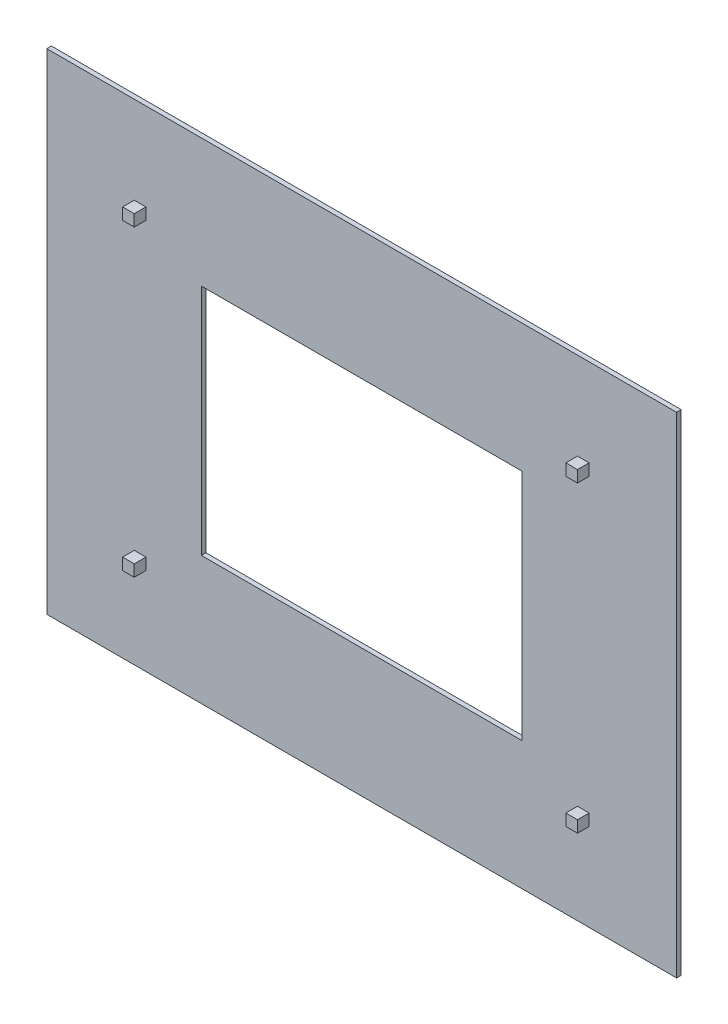
ISO-10303-21;
HEADER;
FILE_DESCRIPTION(('STEP AP214'),'2;1');
FILE_NAME('part.step','',(''),(''),'','','');
FILE_SCHEMA(('AUTOMOTIVE_DESIGN { 1 0 10303 214 1 1 1 1 }'));
ENDSEC;
DATA;
#1=APPLICATION_CONTEXT('core data for automotive mechanical design processes');
#2=APPLICATION_PROTOCOL_DEFINITION('international standard','automotive_design',2000,#1);
#3=PRODUCT_CONTEXT('',#1,'mechanical');
#4=PRODUCT('Part','Part','',(#3));
#5=PRODUCT_RELATED_PRODUCT_CATEGORY('part','',(#4));
#6=PRODUCT_DEFINITION_FORMATION('','',#4);
#7=PRODUCT_DEFINITION_CONTEXT('part definition',#1,'design');
#8=PRODUCT_DEFINITION('design','',#6,#7);
#9=PRODUCT_DEFINITION_SHAPE('','',#8);
#10=(LENGTH_UNIT() NAMED_UNIT(*) SI_UNIT(.MILLI.,.METRE.));
#11=(NAMED_UNIT(*) PLANE_ANGLE_UNIT() SI_UNIT($,.RADIAN.));
#12=(NAMED_UNIT(*) SI_UNIT($,.STERADIAN.) SOLID_ANGLE_UNIT());
#13=UNCERTAINTY_MEASURE_WITH_UNIT(LENGTH_MEASURE(1.E-05),#10,'distance_accuracy_value','');
#14=(GEOMETRIC_REPRESENTATION_CONTEXT(3) GLOBAL_UNCERTAINTY_ASSIGNED_CONTEXT((#13)) GLOBAL_UNIT_ASSIGNED_CONTEXT((#10,
#11,#12)) REPRESENTATION_CONTEXT('',''));
#15=CARTESIAN_POINT('',(0.,0.,0.));
#16=DIRECTION('',(0.,0.,1.));
#17=DIRECTION('',(1.,0.,0.));
#18=AXIS2_PLACEMENT_3D('',#15,#16,#17);
#19=CARTESIAN_POINT('',(0.,0.,1.));
#20=DIRECTION('',(0.,0.,1.));
#21=DIRECTION('',(1.,0.,0.));
#22=AXIS2_PLACEMENT_3D('',#19,#20,#21);
#23=PLANE('',#22);
#24=DIRECTION('',(0.,1.,0.));
#25=VECTOR('',#24,1.);
#26=CARTESIAN_POINT('',(34.925,-25.4,1.));
#27=LINE('',#26,#25);
#28=CARTESIAN_POINT('',(34.925,-25.4,1.));
#29=VERTEX_POINT('',#28);
#30=CARTESIAN_POINT('',(34.925,25.4,1.));
#31=VERTEX_POINT('',#30);
#32=EDGE_CURVE('E61',#29,#31,#27,.T.);
#33=ORIENTED_EDGE('',*,*,#32,.F.);
#34=DIRECTION('',(1.,0.,0.));
#35=VECTOR('',#34,1.);
#36=CARTESIAN_POINT('',(-34.925,-25.4,1.));
#37=LINE('',#36,#35);
#38=CARTESIAN_POINT('',(-34.925,-25.4,1.));
#39=VERTEX_POINT('',#38);
#40=EDGE_CURVE('E227',#39,#29,#37,.T.);
#41=ORIENTED_EDGE('',*,*,#40,.F.);
#42=DIRECTION('',(0.,-1.,0.));
#43=VECTOR('',#42,1.);
#44=CARTESIAN_POINT('',(-34.925,-25.4,1.));
#45=LINE('',#44,#43);
#46=CARTESIAN_POINT('',(-34.925,25.4,1.));
#47=VERTEX_POINT('',#46);
#48=EDGE_CURVE('E210',#47,#39,#45,.T.);
#49=ORIENTED_EDGE('',*,*,#48,.F.);
#50=DIRECTION('',(-1.,0.,0.));
#51=VECTOR('',#50,1.);
#52=CARTESIAN_POINT('',(-34.925,25.4,1.));
#53=LINE('',#52,#51);
#54=EDGE_CURVE('E220',#31,#47,#53,.T.);
#55=ORIENTED_EDGE('',*,*,#54,.F.);
#56=EDGE_LOOP('',(#33,#41,#49,#55));
#57=FACE_BOUND('',#56,.T.);
#58=DIRECTION('',(0.,1.,0.));
#59=VECTOR('',#58,1.);
#60=CARTESIAN_POINT('',(68.58,53.34,1.));
#61=LINE('',#60,#59);
#62=CARTESIAN_POINT('',(68.58,-53.34,1.));
#63=VERTEX_POINT('',#62);
#64=CARTESIAN_POINT('',(68.58,53.34,1.));
#65=VERTEX_POINT('',#64);
#66=EDGE_CURVE('E406',#63,#65,#61,.T.);
#67=ORIENTED_EDGE('',*,*,#66,.T.);
#68=DIRECTION('',(-1.,0.,0.));
#69=VECTOR('',#68,1.);
#70=CARTESIAN_POINT('',(-68.58,53.34,1.));
#71=LINE('',#70,#69);
#72=CARTESIAN_POINT('',(-68.58,53.34,1.));
#73=VERTEX_POINT('',#72);
#74=EDGE_CURVE('E410',#65,#73,#71,.T.);
#75=ORIENTED_EDGE('',*,*,#74,.T.);
#76=DIRECTION('',(0.,-1.,0.));
#77=VECTOR('',#76,1.);
#78=CARTESIAN_POINT('',(-68.58,53.34,1.));
#79=LINE('',#78,#77);
#80=CARTESIAN_POINT('',(-68.58,-53.34,1.));
#81=VERTEX_POINT('',#80);
#82=EDGE_CURVE('E414',#73,#81,#79,.T.);
#83=ORIENTED_EDGE('',*,*,#82,.T.);
#84=DIRECTION('',(1.,0.,0.));
#85=VECTOR('',#84,1.);
#86=CARTESIAN_POINT('',(-68.58,-53.34,1.));
#87=LINE('',#86,#85);
#88=EDGE_CURVE('E417',#81,#63,#87,.T.);
#89=ORIENTED_EDGE('',*,*,#88,.T.);
#90=EDGE_LOOP('',(#67,#75,#83,#89));
#91=FACE_BOUND('',#90,.T.);
#92=DIRECTION('',(-1.,0.,0.));
#93=VECTOR('',#92,1.);
#94=CARTESIAN_POINT('',(-49.53,34.29,1.));
#95=LINE('',#94,#93);
#96=CARTESIAN_POINT('',(-46.99,34.29,1.));
#97=VERTEX_POINT('',#96);
#98=CARTESIAN_POINT('',(-49.53,34.29,1.));
#99=VERTEX_POINT('',#98);
#100=EDGE_CURVE('E383',#97,#99,#95,.T.);
#101=ORIENTED_EDGE('',*,*,#100,.F.);
#102=DIRECTION('',(0.,1.,0.));
#103=VECTOR('',#102,1.);
#104=CARTESIAN_POINT('',(-46.99,34.29,1.));
#105=LINE('',#104,#103);
#106=CARTESIAN_POINT('',(-46.99,31.75,1.));
#107=VERTEX_POINT('',#106);
#108=EDGE_CURVE('E273',#107,#97,#105,.T.);
#109=ORIENTED_EDGE('',*,*,#108,.F.);
#110=DIRECTION('',(1.,0.,0.));
#111=VECTOR('',#110,1.);
#112=CARTESIAN_POINT('',(-49.53,31.75,1.));
#113=LINE('',#112,#111);
#114=CARTESIAN_POINT('',(-49.53,31.75,1.));
#115=VERTEX_POINT('',#114);
#116=EDGE_CURVE('E370',#115,#107,#113,.T.);
#117=ORIENTED_EDGE('',*,*,#116,.F.);
#118=DIRECTION('',(0.,-1.,0.));
#119=VECTOR('',#118,1.);
#120=CARTESIAN_POINT('',(-49.53,34.29,1.));
#121=LINE('',#120,#119);
#122=EDGE_CURVE('E386',#99,#115,#121,.T.);
#123=ORIENTED_EDGE('',*,*,#122,.F.);
#124=EDGE_LOOP('',(#101,#109,#117,#123));
#125=FACE_BOUND('',#124,.T.);
#126=DIRECTION('',(-1.,0.,0.));
#127=VECTOR('',#126,1.);
#128=CARTESIAN_POINT('',(49.53,34.29,1.));
#129=LINE('',#128,#127);
#130=CARTESIAN_POINT('',(49.53,34.29,1.));
#131=VERTEX_POINT('',#130);
#132=CARTESIAN_POINT('',(46.99,34.29,1.));
#133=VERTEX_POINT('',#132);
#134=EDGE_CURVE('E266',#131,#133,#129,.T.);
#135=ORIENTED_EDGE('',*,*,#134,.F.);
#136=DIRECTION('',(0.,1.,0.));
#137=VECTOR('',#136,1.);
#138=CARTESIAN_POINT('',(49.53,34.29,1.));
#139=LINE('',#138,#137);
#140=CARTESIAN_POINT('',(49.53,31.75,1.));
#141=VERTEX_POINT('',#140);
#142=EDGE_CURVE('E269',#141,#131,#139,.T.);
#143=ORIENTED_EDGE('',*,*,#142,.F.);
#144=DIRECTION('',(1.,0.,0.));
#145=VECTOR('',#144,1.);
#146=CARTESIAN_POINT('',(49.53,31.75,1.));
#147=LINE('',#146,#145);
#148=CARTESIAN_POINT('',(46.99,31.75,1.));
#149=VERTEX_POINT('',#148);
#150=EDGE_CURVE('E258',#149,#141,#147,.T.);
#151=ORIENTED_EDGE('',*,*,#150,.F.);
#152=DIRECTION('',(0.,-1.,0.));
#153=VECTOR('',#152,1.);
#154=CARTESIAN_POINT('',(46.99,34.29,1.));
#155=LINE('',#154,#153);
#156=EDGE_CURVE('E261',#133,#149,#155,.T.);
#157=ORIENTED_EDGE('',*,*,#156,.F.);
#158=EDGE_LOOP('',(#135,#143,#151,#157));
#159=FACE_BOUND('',#158,.T.);
#160=DIRECTION('',(0.,1.,0.));
#161=VECTOR('',#160,1.);
#162=CARTESIAN_POINT('',(49.53,-34.29,1.));
#163=LINE('',#162,#161);
#164=CARTESIAN_POINT('',(49.53,-34.29,1.));
#165=VERTEX_POINT('',#164);
#166=CARTESIAN_POINT('',(49.53,-31.75,1.));
#167=VERTEX_POINT('',#166);
#168=EDGE_CURVE('E309',#165,#167,#163,.T.);
#169=ORIENTED_EDGE('',*,*,#168,.F.);
#170=DIRECTION('',(1.,0.,0.));
#171=VECTOR('',#170,1.);
#172=CARTESIAN_POINT('',(49.53,-34.29,1.));
#173=LINE('',#172,#171);
#174=CARTESIAN_POINT('',(46.99,-34.29,1.));
#175=VERTEX_POINT('',#174);
#176=EDGE_CURVE('E246',#175,#165,#173,.T.);
#177=ORIENTED_EDGE('',*,*,#176,.F.);
#178=DIRECTION('',(0.,-1.,0.));
#179=VECTOR('',#178,1.);
#180=CARTESIAN_POINT('',(46.99,-34.29,1.));
#181=LINE('',#180,#179);
#182=CARTESIAN_POINT('',(46.99,-31.75,1.));
#183=VERTEX_POINT('',#182);
#184=EDGE_CURVE('E301',#183,#175,#181,.T.);
#185=ORIENTED_EDGE('',*,*,#184,.F.);
#186=DIRECTION('',(-1.,0.,0.));
#187=VECTOR('',#186,1.);
#188=CARTESIAN_POINT('',(49.53,-31.75,1.));
#189=LINE('',#188,#187);
#190=EDGE_CURVE('E304',#167,#183,#189,.T.);
#191=ORIENTED_EDGE('',*,*,#190,.F.);
#192=EDGE_LOOP('',(#169,#177,#185,#191));
#193=FACE_BOUND('',#192,.T.);
#194=DIRECTION('',(1.,0.,0.));
#195=VECTOR('',#194,1.);
#196=CARTESIAN_POINT('',(-49.53,-34.29,1.));
#197=LINE('',#196,#195);
#198=CARTESIAN_POINT('',(-49.53,-34.29,1.));
#199=VERTEX_POINT('',#198);
#200=CARTESIAN_POINT('',(-46.99,-34.29,1.));
#201=VERTEX_POINT('',#200);
#202=EDGE_CURVE('E348',#199,#201,#197,.T.);
#203=ORIENTED_EDGE('',*,*,#202,.F.);
#204=DIRECTION('',(0.,-1.,0.));
#205=VECTOR('',#204,1.);
#206=CARTESIAN_POINT('',(-49.53,-34.29,1.));
#207=LINE('',#206,#205);
#208=CARTESIAN_POINT('',(-49.53,-31.75,1.));
#209=VERTEX_POINT('',#208);
#210=EDGE_CURVE('E289',#209,#199,#207,.T.);
#211=ORIENTED_EDGE('',*,*,#210,.F.);
#212=DIRECTION('',(-1.,0.,0.));
#213=VECTOR('',#212,1.);
#214=CARTESIAN_POINT('',(-49.53,-31.75,1.));
#215=LINE('',#214,#213);
#216=CARTESIAN_POINT('',(-46.99,-31.75,1.));
#217=VERTEX_POINT('',#216);
#218=EDGE_CURVE('E340',#217,#209,#215,.T.);
#219=ORIENTED_EDGE('',*,*,#218,.F.);
#220=DIRECTION('',(0.,1.,0.));
#221=VECTOR('',#220,1.);
#222=CARTESIAN_POINT('',(-46.99,-34.29,1.));
#223=LINE('',#222,#221);
#224=EDGE_CURVE('E343',#201,#217,#223,.T.);
#225=ORIENTED_EDGE('',*,*,#224,.F.);
#226=EDGE_LOOP('',(#203,#211,#219,#225));
#227=FACE_BOUND('',#226,.T.);
#228=ADVANCED_FACE('F45',(#57,#91,#125,#159,#193,#227),#23,.T.);
#229=CARTESIAN_POINT('',(68.58,53.34,1.));
#230=DIRECTION('',(-1.,0.,0.));
#231=DIRECTION('',(0.,-1.,0.));
#232=AXIS2_PLACEMENT_3D('',#229,#230,#231);
#233=PLANE('',#232);
#234=DIRECTION('',(0.,1.,0.));
#235=VECTOR('',#234,1.);
#236=CARTESIAN_POINT('',(68.58,53.34,0.));
#237=LINE('',#236,#235);
#238=CARTESIAN_POINT('',(68.58,-53.34,0.));
#239=VERTEX_POINT('',#238);
#240=CARTESIAN_POINT('',(68.58,53.34,0.));
#241=VERTEX_POINT('',#240);
#242=EDGE_CURVE('E405',#239,#241,#237,.T.);
#243=ORIENTED_EDGE('',*,*,#242,.T.);
#244=DIRECTION('',(0.,0.,-1.));
#245=VECTOR('',#244,1.);
#246=CARTESIAN_POINT('',(68.58,53.34,1.));
#247=LINE('',#246,#245);
#248=EDGE_CURVE('E443',#65,#241,#247,.T.);
#249=ORIENTED_EDGE('',*,*,#248,.F.);
#250=ORIENTED_EDGE('',*,*,#66,.F.);
#251=DIRECTION('',(0.,0.,-1.));
#252=VECTOR('',#251,1.);
#253=CARTESIAN_POINT('',(68.58,-53.34,1.));
#254=LINE('',#253,#252);
#255=EDGE_CURVE('E420',#63,#239,#254,.T.);
#256=ORIENTED_EDGE('',*,*,#255,.T.);
#257=EDGE_LOOP('',(#243,#249,#250,#256));
#258=FACE_BOUND('',#257,.T.);
#259=ADVANCED_FACE('F47',(#258),#233,.F.);
#260=CARTESIAN_POINT('',(-68.58,53.34,1.));
#261=DIRECTION('',(0.,-1.,0.));
#262=DIRECTION('',(0.,0.,-1.));
#263=AXIS2_PLACEMENT_3D('',#260,#261,#262);
#264=PLANE('',#263);
#265=DIRECTION('',(-1.,0.,0.));
#266=VECTOR('',#265,1.);
#267=CARTESIAN_POINT('',(-68.58,53.34,0.));
#268=LINE('',#267,#266);
#269=CARTESIAN_POINT('',(-68.58,53.34,0.));
#270=VERTEX_POINT('',#269);
#271=EDGE_CURVE('E424',#241,#270,#268,.T.);
#272=ORIENTED_EDGE('',*,*,#271,.T.);
#273=DIRECTION('',(0.,0.,-1.));
#274=VECTOR('',#273,1.);
#275=CARTESIAN_POINT('',(-68.58,53.34,1.));
#276=LINE('',#275,#274);
#277=EDGE_CURVE('E439',#73,#270,#276,.T.);
#278=ORIENTED_EDGE('',*,*,#277,.F.);
#279=ORIENTED_EDGE('',*,*,#74,.F.);
#280=ORIENTED_EDGE('',*,*,#248,.T.);
#281=EDGE_LOOP('',(#272,#278,#279,#280));
#282=FACE_BOUND('',#281,.T.);
#283=ADVANCED_FACE('F479',(#282),#264,.F.);
#284=CARTESIAN_POINT('',(-68.58,53.34,1.));
#285=DIRECTION('',(1.,0.,0.));
#286=DIRECTION('',(0.,1.,0.));
#287=AXIS2_PLACEMENT_3D('',#284,#285,#286);
#288=PLANE('',#287);
#289=DIRECTION('',(0.,-1.,0.));
#290=VECTOR('',#289,1.);
#291=CARTESIAN_POINT('',(-68.58,53.34,0.));
#292=LINE('',#291,#290);
#293=CARTESIAN_POINT('',(-68.58,-53.34,0.));
#294=VERTEX_POINT('',#293);
#295=EDGE_CURVE('E427',#270,#294,#292,.T.);
#296=ORIENTED_EDGE('',*,*,#295,.T.);
#297=DIRECTION('',(0.,0.,-1.));
#298=VECTOR('',#297,1.);
#299=CARTESIAN_POINT('',(-68.58,-53.34,1.));
#300=LINE('',#299,#298);
#301=EDGE_CURVE('E435',#81,#294,#300,.T.);
#302=ORIENTED_EDGE('',*,*,#301,.F.);
#303=ORIENTED_EDGE('',*,*,#82,.F.);
#304=ORIENTED_EDGE('',*,*,#277,.T.);
#305=EDGE_LOOP('',(#296,#302,#303,#304));
#306=FACE_BOUND('',#305,.T.);
#307=ADVANCED_FACE('F489',(#306),#288,.F.);
#308=CARTESIAN_POINT('',(-68.58,-53.34,1.));
#309=DIRECTION('',(0.,1.,0.));
#310=DIRECTION('',(0.,0.,1.));
#311=AXIS2_PLACEMENT_3D('',#308,#309,#310);
#312=PLANE('',#311);
#313=DIRECTION('',(1.,0.,0.));
#314=VECTOR('',#313,1.);
#315=CARTESIAN_POINT('',(-68.58,-53.34,0.));
#316=LINE('',#315,#314);
#317=EDGE_CURVE('E411',#294,#239,#316,.T.);
#318=ORIENTED_EDGE('',*,*,#317,.T.);
#319=ORIENTED_EDGE('',*,*,#255,.F.);
#320=ORIENTED_EDGE('',*,*,#88,.F.);
#321=ORIENTED_EDGE('',*,*,#301,.T.);
#322=EDGE_LOOP('',(#318,#319,#320,#321));
#323=FACE_BOUND('',#322,.T.);
#324=ADVANCED_FACE('F486',(#323),#312,.F.);
#325=CARTESIAN_POINT('',(0.,0.,0.));
#326=DIRECTION('',(0.,0.,1.));
#327=DIRECTION('',(1.,0.,0.));
#328=AXIS2_PLACEMENT_3D('',#325,#326,#327);
#329=PLANE('',#328);
#330=DIRECTION('',(1.,0.,0.));
#331=VECTOR('',#330,1.);
#332=CARTESIAN_POINT('',(0.,-25.4,0.));
#333=LINE('',#332,#331);
#334=CARTESIAN_POINT('',(-34.925,-25.4,0.));
#335=VERTEX_POINT('',#334);
#336=CARTESIAN_POINT('',(34.925,-25.4,0.));
#337=VERTEX_POINT('',#336);
#338=EDGE_CURVE('E54',#335,#337,#333,.T.);
#339=ORIENTED_EDGE('',*,*,#338,.T.);
#340=DIRECTION('',(0.,1.,0.));
#341=VECTOR('',#340,1.);
#342=CARTESIAN_POINT('',(34.925,0.,0.));
#343=LINE('',#342,#341);
#344=CARTESIAN_POINT('',(34.925,25.4,0.));
#345=VERTEX_POINT('',#344);
#346=EDGE_CURVE('E11',#337,#345,#343,.T.);
#347=ORIENTED_EDGE('',*,*,#346,.T.);
#348=DIRECTION('',(-1.,0.,0.));
#349=VECTOR('',#348,1.);
#350=CARTESIAN_POINT('',(0.,25.4,0.));
#351=LINE('',#350,#349);
#352=CARTESIAN_POINT('',(-34.925,25.4,0.));
#353=VERTEX_POINT('',#352);
#354=EDGE_CURVE('E447',#345,#353,#351,.T.);
#355=ORIENTED_EDGE('',*,*,#354,.T.);
#356=DIRECTION('',(0.,-1.,0.));
#357=VECTOR('',#356,1.);
#358=CARTESIAN_POINT('',(-34.925,0.,0.));
#359=LINE('',#358,#357);
#360=EDGE_CURVE('E213',#353,#335,#359,.T.);
#361=ORIENTED_EDGE('',*,*,#360,.T.);
#362=EDGE_LOOP('',(#339,#347,#355,#361));
#363=FACE_BOUND('',#362,.T.);
#364=ORIENTED_EDGE('',*,*,#242,.F.);
#365=ORIENTED_EDGE('',*,*,#317,.F.);
#366=ORIENTED_EDGE('',*,*,#295,.F.);
#367=ORIENTED_EDGE('',*,*,#271,.F.);
#368=EDGE_LOOP('',(#364,#365,#366,#367));
#369=FACE_BOUND('',#368,.T.);
#370=ADVANCED_FACE('F454',(#363,#369),#329,.F.);
#371=CARTESIAN_POINT('',(-46.99,34.29,3.54));
#372=DIRECTION('',(-1.,0.,0.));
#373=DIRECTION('',(0.,0.,1.));
#374=AXIS2_PLACEMENT_3D('',#371,#372,#373);
#375=PLANE('',#374);
#376=ORIENTED_EDGE('',*,*,#108,.T.);
#377=DIRECTION('',(0.,0.,-1.));
#378=VECTOR('',#377,1.);
#379=CARTESIAN_POINT('',(-46.99,34.29,3.54));
#380=LINE('',#379,#378);
#381=CARTESIAN_POINT('',(-46.99,34.29,3.54));
#382=VERTEX_POINT('',#381);
#383=EDGE_CURVE('E402',#382,#97,#380,.T.);
#384=ORIENTED_EDGE('',*,*,#383,.F.);
#385=DIRECTION('',(0.,1.,0.));
#386=VECTOR('',#385,1.);
#387=CARTESIAN_POINT('',(-46.99,34.29,3.54));
#388=LINE('',#387,#386);
#389=CARTESIAN_POINT('',(-46.99,31.75,3.54));
#390=VERTEX_POINT('',#389);
#391=EDGE_CURVE('E365',#390,#382,#388,.T.);
#392=ORIENTED_EDGE('',*,*,#391,.F.);
#393=DIRECTION('',(0.,0.,-1.));
#394=VECTOR('',#393,1.);
#395=CARTESIAN_POINT('',(-46.99,31.75,3.54));
#396=LINE('',#395,#394);
#397=EDGE_CURVE('E379',#390,#107,#396,.T.);
#398=ORIENTED_EDGE('',*,*,#397,.T.);
#399=EDGE_LOOP('',(#376,#384,#392,#398));
#400=FACE_BOUND('',#399,.T.);
#401=ADVANCED_FACE('F483',(#400),#375,.F.);
#402=CARTESIAN_POINT('',(-49.53,34.29,3.54));
#403=DIRECTION('',(0.,-1.,0.));
#404=DIRECTION('',(0.,0.,-1.));
#405=AXIS2_PLACEMENT_3D('',#402,#403,#404);
#406=PLANE('',#405);
#407=ORIENTED_EDGE('',*,*,#100,.T.);
#408=DIRECTION('',(0.,0.,-1.));
#409=VECTOR('',#408,1.);
#410=CARTESIAN_POINT('',(-49.53,34.29,3.54));
#411=LINE('',#410,#409);
#412=CARTESIAN_POINT('',(-49.53,34.29,3.54));
#413=VERTEX_POINT('',#412);
#414=EDGE_CURVE('E398',#413,#99,#411,.T.);
#415=ORIENTED_EDGE('',*,*,#414,.F.);
#416=DIRECTION('',(-1.,0.,0.));
#417=VECTOR('',#416,1.);
#418=CARTESIAN_POINT('',(-49.53,34.29,3.54));
#419=LINE('',#418,#417);
#420=EDGE_CURVE('E369',#382,#413,#419,.T.);
#421=ORIENTED_EDGE('',*,*,#420,.F.);
#422=ORIENTED_EDGE('',*,*,#383,.T.);
#423=EDGE_LOOP('',(#407,#415,#421,#422));
#424=FACE_BOUND('',#423,.T.);
#425=ADVANCED_FACE('F557',(#424),#406,.F.);
#426=CARTESIAN_POINT('',(-49.53,34.29,3.54));
#427=DIRECTION('',(1.,0.,0.));
#428=DIRECTION('',(0.,0.,-1.));
#429=AXIS2_PLACEMENT_3D('',#426,#427,#428);
#430=PLANE('',#429);
#431=ORIENTED_EDGE('',*,*,#122,.T.);
#432=DIRECTION('',(0.,0.,-1.));
#433=VECTOR('',#432,1.);
#434=CARTESIAN_POINT('',(-49.53,31.75,3.54));
#435=LINE('',#434,#433);
#436=CARTESIAN_POINT('',(-49.53,31.75,3.54));
#437=VERTEX_POINT('',#436);
#438=EDGE_CURVE('E395',#437,#115,#435,.T.);
#439=ORIENTED_EDGE('',*,*,#438,.F.);
#440=DIRECTION('',(0.,-1.,0.));
#441=VECTOR('',#440,1.);
#442=CARTESIAN_POINT('',(-49.53,34.29,3.54));
#443=LINE('',#442,#441);
#444=EDGE_CURVE('E373',#413,#437,#443,.T.);
#445=ORIENTED_EDGE('',*,*,#444,.F.);
#446=ORIENTED_EDGE('',*,*,#414,.T.);
#447=EDGE_LOOP('',(#431,#439,#445,#446));
#448=FACE_BOUND('',#447,.T.);
#449=ADVANCED_FACE('F554',(#448),#430,.F.);
#450=CARTESIAN_POINT('',(-49.53,31.75,3.54));
#451=DIRECTION('',(0.,1.,0.));
#452=DIRECTION('',(0.,0.,1.));
#453=AXIS2_PLACEMENT_3D('',#450,#451,#452);
#454=PLANE('',#453);
#455=ORIENTED_EDGE('',*,*,#116,.T.);
#456=ORIENTED_EDGE('',*,*,#397,.F.);
#457=DIRECTION('',(1.,0.,0.));
#458=VECTOR('',#457,1.);
#459=CARTESIAN_POINT('',(-49.53,31.75,3.54));
#460=LINE('',#459,#458);
#461=EDGE_CURVE('E376',#437,#390,#460,.T.);
#462=ORIENTED_EDGE('',*,*,#461,.F.);
#463=ORIENTED_EDGE('',*,*,#438,.T.);
#464=EDGE_LOOP('',(#455,#456,#462,#463));
#465=FACE_BOUND('',#464,.T.);
#466=ADVANCED_FACE('F550',(#465),#454,.F.);
#467=CARTESIAN_POINT('',(0.,0.,3.54));
#468=DIRECTION('',(0.,0.,1.));
#469=DIRECTION('',(1.,0.,0.));
#470=AXIS2_PLACEMENT_3D('',#467,#468,#469);
#471=PLANE('',#470);
#472=ORIENTED_EDGE('',*,*,#391,.T.);
#473=ORIENTED_EDGE('',*,*,#420,.T.);
#474=ORIENTED_EDGE('',*,*,#444,.T.);
#475=ORIENTED_EDGE('',*,*,#461,.T.);
#476=EDGE_LOOP('',(#472,#473,#474,#475));
#477=FACE_BOUND('',#476,.T.);
#478=ADVANCED_FACE('F546',(#477),#471,.T.);
#479=CARTESIAN_POINT('',(49.53,34.29,3.54));
#480=DIRECTION('',(-1.,0.,0.));
#481=DIRECTION('',(0.,0.,1.));
#482=AXIS2_PLACEMENT_3D('',#479,#480,#481);
#483=PLANE('',#482);
#484=ORIENTED_EDGE('',*,*,#142,.T.);
#485=DIRECTION('',(0.,0.,-1.));
#486=VECTOR('',#485,1.);
#487=CARTESIAN_POINT('',(49.53,34.29,3.54));
#488=LINE('',#487,#486);
#489=CARTESIAN_POINT('',(49.53,34.29,3.54));
#490=VERTEX_POINT('',#489);
#491=EDGE_CURVE('E242',#490,#131,#488,.T.);
#492=ORIENTED_EDGE('',*,*,#491,.F.);
#493=DIRECTION('',(0.,1.,0.));
#494=VECTOR('',#493,1.);
#495=CARTESIAN_POINT('',(49.53,34.29,3.54));
#496=LINE('',#495,#494);
#497=CARTESIAN_POINT('',(49.53,31.75,3.54));
#498=VERTEX_POINT('',#497);
#499=EDGE_CURVE('E262',#498,#490,#496,.T.);
#500=ORIENTED_EDGE('',*,*,#499,.F.);
#501=DIRECTION('',(0.,0.,-1.));
#502=VECTOR('',#501,1.);
#503=CARTESIAN_POINT('',(49.53,31.75,3.54));
#504=LINE('',#503,#502);
#505=EDGE_CURVE('E253',#498,#141,#504,.T.);
#506=ORIENTED_EDGE('',*,*,#505,.T.);
#507=EDGE_LOOP('',(#484,#492,#500,#506));
#508=FACE_BOUND('',#507,.T.);
#509=ADVANCED_FACE('F549',(#508),#483,.F.);
#510=CARTESIAN_POINT('',(49.53,34.29,3.54));
#511=DIRECTION('',(0.,-1.,0.));
#512=DIRECTION('',(0.,0.,-1.));
#513=AXIS2_PLACEMENT_3D('',#510,#511,#512);
#514=PLANE('',#513);
#515=ORIENTED_EDGE('',*,*,#134,.T.);
#516=DIRECTION('',(0.,0.,-1.));
#517=VECTOR('',#516,1.);
#518=CARTESIAN_POINT('',(46.99,34.29,3.54));
#519=LINE('',#518,#517);
#520=CARTESIAN_POINT('',(46.99,34.29,3.54));
#521=VERTEX_POINT('',#520);
#522=EDGE_CURVE('E245',#521,#133,#519,.T.);
#523=ORIENTED_EDGE('',*,*,#522,.F.);
#524=DIRECTION('',(-1.,0.,0.));
#525=VECTOR('',#524,1.);
#526=CARTESIAN_POINT('',(49.53,34.29,3.54));
#527=LINE('',#526,#525);
#528=EDGE_CURVE('E279',#490,#521,#527,.T.);
#529=ORIENTED_EDGE('',*,*,#528,.F.);
#530=ORIENTED_EDGE('',*,*,#491,.T.);
#531=EDGE_LOOP('',(#515,#523,#529,#530));
#532=FACE_BOUND('',#531,.T.);
#533=ADVANCED_FACE('F634',(#532),#514,.F.);
#534=CARTESIAN_POINT('',(46.99,34.29,3.54));
#535=DIRECTION('',(1.,0.,0.));
#536=DIRECTION('',(0.,0.,-1.));
#537=AXIS2_PLACEMENT_3D('',#534,#535,#536);
#538=PLANE('',#537);
#539=ORIENTED_EDGE('',*,*,#156,.T.);
#540=DIRECTION('',(0.,0.,-1.));
#541=VECTOR('',#540,1.);
#542=CARTESIAN_POINT('',(46.99,31.75,3.54));
#543=LINE('',#542,#541);
#544=CARTESIAN_POINT('',(46.99,31.75,3.54));
#545=VERTEX_POINT('',#544);
#546=EDGE_CURVE('E250',#545,#149,#543,.T.);
#547=ORIENTED_EDGE('',*,*,#546,.F.);
#548=DIRECTION('',(0.,-1.,0.));
#549=VECTOR('',#548,1.);
#550=CARTESIAN_POINT('',(46.99,34.29,3.54));
#551=LINE('',#550,#549);
#552=EDGE_CURVE('E276',#521,#545,#551,.T.);
#553=ORIENTED_EDGE('',*,*,#552,.F.);
#554=ORIENTED_EDGE('',*,*,#522,.T.);
#555=EDGE_LOOP('',(#539,#547,#553,#554));
#556=FACE_BOUND('',#555,.T.);
#557=ADVANCED_FACE('F642',(#556),#538,.F.);
#558=CARTESIAN_POINT('',(49.53,31.75,3.54));
#559=DIRECTION('',(0.,1.,0.));
#560=DIRECTION('',(0.,0.,1.));
#561=AXIS2_PLACEMENT_3D('',#558,#559,#560);
#562=PLANE('',#561);
#563=ORIENTED_EDGE('',*,*,#150,.T.);
#564=ORIENTED_EDGE('',*,*,#505,.F.);
#565=DIRECTION('',(1.,0.,0.));
#566=VECTOR('',#565,1.);
#567=CARTESIAN_POINT('',(49.53,31.75,3.54));
#568=LINE('',#567,#566);
#569=EDGE_CURVE('E257',#545,#498,#568,.T.);
#570=ORIENTED_EDGE('',*,*,#569,.F.);
#571=ORIENTED_EDGE('',*,*,#546,.T.);
#572=EDGE_LOOP('',(#563,#564,#570,#571));
#573=FACE_BOUND('',#572,.T.);
#574=ADVANCED_FACE('F651',(#573),#562,.F.);
#575=CARTESIAN_POINT('',(0.,0.,3.54));
#576=DIRECTION('',(0.,0.,-1.));
#577=DIRECTION('',(-1.,0.,0.));
#578=AXIS2_PLACEMENT_3D('',#575,#576,#577);
#579=PLANE('',#578);
#580=ORIENTED_EDGE('',*,*,#499,.T.);
#581=ORIENTED_EDGE('',*,*,#528,.T.);
#582=ORIENTED_EDGE('',*,*,#552,.T.);
#583=ORIENTED_EDGE('',*,*,#569,.T.);
#584=EDGE_LOOP('',(#580,#581,#582,#583));
#585=FACE_BOUND('',#584,.T.);
#586=ADVANCED_FACE('F660',(#585),#579,.F.);
#587=CARTESIAN_POINT('',(49.53,-34.29,3.54));
#588=DIRECTION('',(0.,1.,0.));
#589=DIRECTION('',(0.,0.,1.));
#590=AXIS2_PLACEMENT_3D('',#587,#588,#589);
#591=PLANE('',#590);
#592=ORIENTED_EDGE('',*,*,#176,.T.);
#593=DIRECTION('',(0.,0.,-1.));
#594=VECTOR('',#593,1.);
#595=CARTESIAN_POINT('',(49.53,-34.29,3.54));
#596=LINE('',#595,#594);
#597=CARTESIAN_POINT('',(49.53,-34.29,3.54));
#598=VERTEX_POINT('',#597);
#599=EDGE_CURVE('E285',#598,#165,#596,.T.);
#600=ORIENTED_EDGE('',*,*,#599,.F.);
#601=DIRECTION('',(1.,0.,0.));
#602=VECTOR('',#601,1.);
#603=CARTESIAN_POINT('',(49.53,-34.29,3.54));
#604=LINE('',#603,#602);
#605=CARTESIAN_POINT('',(46.99,-34.29,3.54));
#606=VERTEX_POINT('',#605);
#607=EDGE_CURVE('E305',#606,#598,#604,.T.);
#608=ORIENTED_EDGE('',*,*,#607,.F.);
#609=DIRECTION('',(0.,0.,-1.));
#610=VECTOR('',#609,1.);
#611=CARTESIAN_POINT('',(46.99,-34.29,3.54));
#612=LINE('',#611,#610);
#613=EDGE_CURVE('E296',#606,#175,#612,.T.);
#614=ORIENTED_EDGE('',*,*,#613,.T.);
#615=EDGE_LOOP('',(#592,#600,#608,#614));
#616=FACE_BOUND('',#615,.T.);
#617=ADVANCED_FACE('F669',(#616),#591,.F.);
#618=CARTESIAN_POINT('',(49.53,-34.29,3.54));
#619=DIRECTION('',(-1.,0.,0.));
#620=DIRECTION('',(0.,0.,1.));
#621=AXIS2_PLACEMENT_3D('',#618,#619,#620);
#622=PLANE('',#621);
#623=ORIENTED_EDGE('',*,*,#168,.T.);
#624=DIRECTION('',(0.,0.,-1.));
#625=VECTOR('',#624,1.);
#626=CARTESIAN_POINT('',(49.53,-31.75,3.54));
#627=LINE('',#626,#625);
#628=CARTESIAN_POINT('',(49.53,-31.75,3.54));
#629=VERTEX_POINT('',#628);
#630=EDGE_CURVE('E288',#629,#167,#627,.T.);
#631=ORIENTED_EDGE('',*,*,#630,.F.);
#632=DIRECTION('',(0.,1.,0.));
#633=VECTOR('',#632,1.);
#634=CARTESIAN_POINT('',(49.53,-34.29,3.54));
#635=LINE('',#634,#633);
#636=EDGE_CURVE('E320',#598,#629,#635,.T.);
#637=ORIENTED_EDGE('',*,*,#636,.F.);
#638=ORIENTED_EDGE('',*,*,#599,.T.);
#639=EDGE_LOOP('',(#623,#631,#637,#638));
#640=FACE_BOUND('',#639,.T.);
#641=ADVANCED_FACE('F678',(#640),#622,.F.);
#642=CARTESIAN_POINT('',(49.53,-31.75,3.54));
#643=DIRECTION('',(0.,-1.,0.));
#644=DIRECTION('',(0.,0.,-1.));
#645=AXIS2_PLACEMENT_3D('',#642,#643,#644);
#646=PLANE('',#645);
#647=ORIENTED_EDGE('',*,*,#190,.T.);
#648=DIRECTION('',(0.,0.,-1.));
#649=VECTOR('',#648,1.);
#650=CARTESIAN_POINT('',(46.99,-31.75,3.54));
#651=LINE('',#650,#649);
#652=CARTESIAN_POINT('',(46.99,-31.75,3.54));
#653=VERTEX_POINT('',#652);
#654=EDGE_CURVE('E293',#653,#183,#651,.T.);
#655=ORIENTED_EDGE('',*,*,#654,.F.);
#656=DIRECTION('',(-1.,0.,0.));
#657=VECTOR('',#656,1.);
#658=CARTESIAN_POINT('',(49.53,-31.75,3.54));
#659=LINE('',#658,#657);
#660=EDGE_CURVE('E317',#629,#653,#659,.T.);
#661=ORIENTED_EDGE('',*,*,#660,.F.);
#662=ORIENTED_EDGE('',*,*,#630,.T.);
#663=EDGE_LOOP('',(#647,#655,#661,#662));
#664=FACE_BOUND('',#663,.T.);
#665=ADVANCED_FACE('F687',(#664),#646,.F.);
#666=CARTESIAN_POINT('',(46.99,-34.29,3.54));
#667=DIRECTION('',(1.,0.,0.));
#668=DIRECTION('',(0.,0.,-1.));
#669=AXIS2_PLACEMENT_3D('',#666,#667,#668);
#670=PLANE('',#669);
#671=ORIENTED_EDGE('',*,*,#184,.T.);
#672=ORIENTED_EDGE('',*,*,#613,.F.);
#673=DIRECTION('',(0.,-1.,0.));
#674=VECTOR('',#673,1.);
#675=CARTESIAN_POINT('',(46.99,-34.29,3.54));
#676=LINE('',#675,#674);
#677=EDGE_CURVE('E300',#653,#606,#676,.T.);
#678=ORIENTED_EDGE('',*,*,#677,.F.);
#679=ORIENTED_EDGE('',*,*,#654,.T.);
#680=EDGE_LOOP('',(#671,#672,#678,#679));
#681=FACE_BOUND('',#680,.T.);
#682=ADVANCED_FACE('F696',(#681),#670,.F.);
#683=CARTESIAN_POINT('',(0.,0.,3.54));
#684=DIRECTION('',(0.,0.,-1.));
#685=DIRECTION('',(-1.,0.,0.));
#686=AXIS2_PLACEMENT_3D('',#683,#684,#685);
#687=PLANE('',#686);
#688=ORIENTED_EDGE('',*,*,#607,.T.);
#689=ORIENTED_EDGE('',*,*,#636,.T.);
#690=ORIENTED_EDGE('',*,*,#660,.T.);
#691=ORIENTED_EDGE('',*,*,#677,.T.);
#692=EDGE_LOOP('',(#688,#689,#690,#691));
#693=FACE_BOUND('',#692,.T.);
#694=ADVANCED_FACE('F705',(#693),#687,.F.);
#695=CARTESIAN_POINT('',(-49.53,-34.29,3.54));
#696=DIRECTION('',(1.,0.,0.));
#697=DIRECTION('',(0.,0.,-1.));
#698=AXIS2_PLACEMENT_3D('',#695,#696,#697);
#699=PLANE('',#698);
#700=ORIENTED_EDGE('',*,*,#210,.T.);
#701=DIRECTION('',(0.,0.,-1.));
#702=VECTOR('',#701,1.);
#703=CARTESIAN_POINT('',(-49.53,-34.29,3.54));
#704=LINE('',#703,#702);
#705=CARTESIAN_POINT('',(-49.53,-34.29,3.54));
#706=VERTEX_POINT('',#705);
#707=EDGE_CURVE('E237',#706,#199,#704,.T.);
#708=ORIENTED_EDGE('',*,*,#707,.F.);
#709=DIRECTION('',(0.,-1.,0.));
#710=VECTOR('',#709,1.);
#711=CARTESIAN_POINT('',(-49.53,-34.29,3.54));
#712=LINE('',#711,#710);
#713=CARTESIAN_POINT('',(-49.53,-31.75,3.54));
#714=VERTEX_POINT('',#713);
#715=EDGE_CURVE('E344',#714,#706,#712,.T.);
#716=ORIENTED_EDGE('',*,*,#715,.F.);
#717=DIRECTION('',(0.,0.,-1.));
#718=VECTOR('',#717,1.);
#719=CARTESIAN_POINT('',(-49.53,-31.75,3.54));
#720=LINE('',#719,#718);
#721=EDGE_CURVE('E335',#714,#209,#720,.T.);
#722=ORIENTED_EDGE('',*,*,#721,.T.);
#723=EDGE_LOOP('',(#700,#708,#716,#722));
#724=FACE_BOUND('',#723,.T.);
#725=ADVANCED_FACE('F536',(#724),#699,.F.);
#726=CARTESIAN_POINT('',(-49.53,-34.29,3.54));
#727=DIRECTION('',(0.,1.,0.));
#728=DIRECTION('',(0.,0.,1.));
#729=AXIS2_PLACEMENT_3D('',#726,#727,#728);
#730=PLANE('',#729);
#731=ORIENTED_EDGE('',*,*,#202,.T.);
#732=DIRECTION('',(0.,0.,-1.));
#733=VECTOR('',#732,1.);
#734=CARTESIAN_POINT('',(-46.99,-34.29,3.54));
#735=LINE('',#734,#733);
#736=CARTESIAN_POINT('',(-46.99,-34.29,3.54));
#737=VERTEX_POINT('',#736);
#738=EDGE_CURVE('E328',#737,#201,#735,.T.);
#739=ORIENTED_EDGE('',*,*,#738,.F.);
#740=DIRECTION('',(1.,0.,0.));
#741=VECTOR('',#740,1.);
#742=CARTESIAN_POINT('',(-49.53,-34.29,3.54));
#743=LINE('',#742,#741);
#744=EDGE_CURVE('E359',#706,#737,#743,.T.);
#745=ORIENTED_EDGE('',*,*,#744,.F.);
#746=ORIENTED_EDGE('',*,*,#707,.T.);
#747=EDGE_LOOP('',(#731,#739,#745,#746));
#748=FACE_BOUND('',#747,.T.);
#749=ADVANCED_FACE('F526',(#748),#730,.F.);
#750=CARTESIAN_POINT('',(-46.99,-34.29,3.54));
#751=DIRECTION('',(-1.,0.,0.));
#752=DIRECTION('',(0.,0.,1.));
#753=AXIS2_PLACEMENT_3D('',#750,#751,#752);
#754=PLANE('',#753);
#755=ORIENTED_EDGE('',*,*,#224,.T.);
#756=DIRECTION('',(0.,0.,-1.));
#757=VECTOR('',#756,1.);
#758=CARTESIAN_POINT('',(-46.99,-31.75,3.54));
#759=LINE('',#758,#757);
#760=CARTESIAN_POINT('',(-46.99,-31.75,3.54));
#761=VERTEX_POINT('',#760);
#762=EDGE_CURVE('E332',#761,#217,#759,.T.);
#763=ORIENTED_EDGE('',*,*,#762,.F.);
#764=DIRECTION('',(0.,1.,0.));
#765=VECTOR('',#764,1.);
#766=CARTESIAN_POINT('',(-46.99,-34.29,3.54));
#767=LINE('',#766,#765);
#768=EDGE_CURVE('E356',#737,#761,#767,.T.);
#769=ORIENTED_EDGE('',*,*,#768,.F.);
#770=ORIENTED_EDGE('',*,*,#738,.T.);
#771=EDGE_LOOP('',(#755,#763,#769,#770));
#772=FACE_BOUND('',#771,.T.);
#773=ADVANCED_FACE('F530',(#772),#754,.F.);
#774=CARTESIAN_POINT('',(-49.53,-31.75,3.54));
#775=DIRECTION('',(0.,-1.,0.));
#776=DIRECTION('',(0.,0.,-1.));
#777=AXIS2_PLACEMENT_3D('',#774,#775,#776);
#778=PLANE('',#777);
#779=ORIENTED_EDGE('',*,*,#218,.T.);
#780=ORIENTED_EDGE('',*,*,#721,.F.);
#781=DIRECTION('',(-1.,0.,0.));
#782=VECTOR('',#781,1.);
#783=CARTESIAN_POINT('',(-49.53,-31.75,3.54));
#784=LINE('',#783,#782);
#785=EDGE_CURVE('E339',#761,#714,#784,.T.);
#786=ORIENTED_EDGE('',*,*,#785,.F.);
#787=ORIENTED_EDGE('',*,*,#762,.T.);
#788=EDGE_LOOP('',(#779,#780,#786,#787));
#789=FACE_BOUND('',#788,.T.);
#790=ADVANCED_FACE('F469',(#789),#778,.F.);
#791=CARTESIAN_POINT('',(0.,0.,3.54));
#792=DIRECTION('',(0.,0.,-1.));
#793=DIRECTION('',(-1.,0.,0.));
#794=AXIS2_PLACEMENT_3D('',#791,#792,#793);
#795=PLANE('',#794);
#796=ORIENTED_EDGE('',*,*,#715,.T.);
#797=ORIENTED_EDGE('',*,*,#744,.T.);
#798=ORIENTED_EDGE('',*,*,#768,.T.);
#799=ORIENTED_EDGE('',*,*,#785,.T.);
#800=EDGE_LOOP('',(#796,#797,#798,#799));
#801=FACE_BOUND('',#800,.T.);
#802=ADVANCED_FACE('F461',(#801),#795,.F.);
#803=CARTESIAN_POINT('',(34.925,-25.4,-1.54));
#804=DIRECTION('',(1.,0.,0.));
#805=DIRECTION('',(0.,0.,-1.));
#806=AXIS2_PLACEMENT_3D('',#803,#804,#805);
#807=PLANE('',#806);
#808=DIRECTION('',(0.,0.,1.));
#809=VECTOR('',#808,1.);
#810=CARTESIAN_POINT('',(34.925,-25.4,-1.54));
#811=LINE('',#810,#809);
#812=EDGE_CURVE('E234',#337,#29,#811,.T.);
#813=ORIENTED_EDGE('',*,*,#812,.T.);
#814=ORIENTED_EDGE('',*,*,#32,.T.);
#815=DIRECTION('',(0.,0.,1.));
#816=VECTOR('',#815,1.);
#817=CARTESIAN_POINT('',(34.925,25.4,-1.54));
#818=LINE('',#817,#816);
#819=EDGE_CURVE('E217',#345,#31,#818,.T.);
#820=ORIENTED_EDGE('',*,*,#819,.F.);
#821=ORIENTED_EDGE('',*,*,#346,.F.);
#822=EDGE_LOOP('',(#813,#814,#820,#821));
#823=FACE_BOUND('',#822,.T.);
#824=ADVANCED_FACE('F459',(#823),#807,.F.);
#825=CARTESIAN_POINT('',(-34.925,-25.4,-1.54));
#826=DIRECTION('',(0.,-1.,0.));
#827=DIRECTION('',(0.,0.,-1.));
#828=AXIS2_PLACEMENT_3D('',#825,#826,#827);
#829=PLANE('',#828);
#830=DIRECTION('',(0.,0.,1.));
#831=VECTOR('',#830,1.);
#832=CARTESIAN_POINT('',(-34.925,-25.4,-1.54));
#833=LINE('',#832,#831);
#834=EDGE_CURVE('E216',#335,#39,#833,.T.);
#835=ORIENTED_EDGE('',*,*,#834,.T.);
#836=ORIENTED_EDGE('',*,*,#40,.T.);
#837=ORIENTED_EDGE('',*,*,#812,.F.);
#838=ORIENTED_EDGE('',*,*,#338,.F.);
#839=EDGE_LOOP('',(#835,#836,#837,#838));
#840=FACE_BOUND('',#839,.T.);
#841=ADVANCED_FACE('F458',(#840),#829,.F.);
#842=CARTESIAN_POINT('',(-34.925,-25.4,-1.54));
#843=DIRECTION('',(-1.,0.,0.));
#844=DIRECTION('',(0.,0.,1.));
#845=AXIS2_PLACEMENT_3D('',#842,#843,#844);
#846=PLANE('',#845);
#847=DIRECTION('',(0.,0.,1.));
#848=VECTOR('',#847,1.);
#849=CARTESIAN_POINT('',(-34.925,25.4,-1.54));
#850=LINE('',#849,#848);
#851=EDGE_CURVE('E69',#353,#47,#850,.T.);
#852=ORIENTED_EDGE('',*,*,#851,.T.);
#853=ORIENTED_EDGE('',*,*,#48,.T.);
#854=ORIENTED_EDGE('',*,*,#834,.F.);
#855=ORIENTED_EDGE('',*,*,#360,.F.);
#856=EDGE_LOOP('',(#852,#853,#854,#855));
#857=FACE_BOUND('',#856,.T.);
#858=ADVANCED_FACE('F207',(#857),#846,.F.);
#859=CARTESIAN_POINT('',(-34.925,25.4,-1.54));
#860=DIRECTION('',(0.,1.,0.));
#861=DIRECTION('',(0.,0.,1.));
#862=AXIS2_PLACEMENT_3D('',#859,#860,#861);
#863=PLANE('',#862);
#864=ORIENTED_EDGE('',*,*,#819,.T.);
#865=ORIENTED_EDGE('',*,*,#54,.T.);
#866=ORIENTED_EDGE('',*,*,#851,.F.);
#867=ORIENTED_EDGE('',*,*,#354,.F.);
#868=EDGE_LOOP('',(#864,#865,#866,#867));
#869=FACE_BOUND('',#868,.T.);
#870=ADVANCED_FACE('F221',(#869),#863,.F.);
#871=CLOSED_SHELL('',(#228,#259,#283,#307,#324,#370,#401,#425,#449,#466,#478,#509,#533,#557,
#574,#586,#617,#641,#665,#682,#694,#725,#749,#773,#790,#802,#824,#841,#858,#870));
#872=MANIFOLD_SOLID_BREP('B2',#871);
#873=ADVANCED_BREP_SHAPE_REPRESENTATION('',(#18,#872),#14);
#874=SHAPE_DEFINITION_REPRESENTATION(#9,#873);
ENDSEC;
END-ISO-10303-21;
